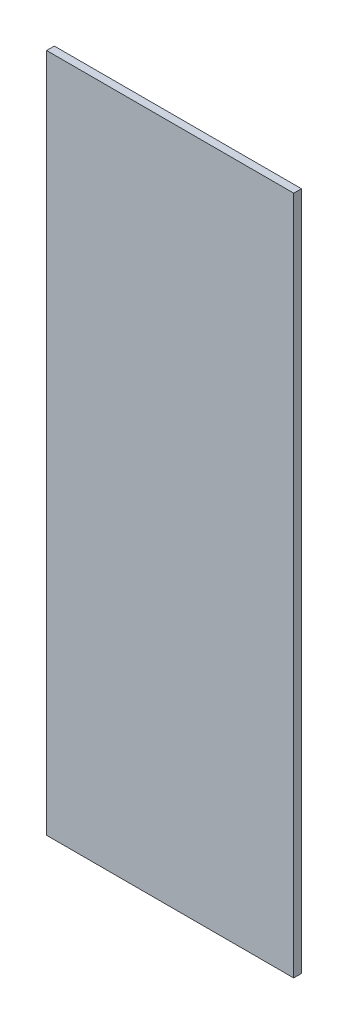
ISO-10303-21;
HEADER;
FILE_DESCRIPTION(('STEP AP214'),'2;1');
FILE_NAME('part.step','',(''),(''),'','','');
FILE_SCHEMA(('AUTOMOTIVE_DESIGN { 1 0 10303 214 1 1 1 1 }'));
ENDSEC;
DATA;
#1=APPLICATION_CONTEXT('core data for automotive mechanical design processes');
#2=APPLICATION_PROTOCOL_DEFINITION('international standard','automotive_design',2000,#1);
#3=PRODUCT_CONTEXT('',#1,'mechanical');
#4=PRODUCT('Part','Part','',(#3));
#5=PRODUCT_RELATED_PRODUCT_CATEGORY('part','',(#4));
#6=PRODUCT_DEFINITION_FORMATION('','',#4);
#7=PRODUCT_DEFINITION_CONTEXT('part definition',#1,'design');
#8=PRODUCT_DEFINITION('design','',#6,#7);
#9=PRODUCT_DEFINITION_SHAPE('','',#8);
#10=(LENGTH_UNIT() NAMED_UNIT(*) SI_UNIT(.MILLI.,.METRE.));
#11=(NAMED_UNIT(*) PLANE_ANGLE_UNIT() SI_UNIT($,.RADIAN.));
#12=(NAMED_UNIT(*) SI_UNIT($,.STERADIAN.) SOLID_ANGLE_UNIT());
#13=UNCERTAINTY_MEASURE_WITH_UNIT(LENGTH_MEASURE(1.E-05),#10,'distance_accuracy_value','');
#14=(GEOMETRIC_REPRESENTATION_CONTEXT(3) GLOBAL_UNCERTAINTY_ASSIGNED_CONTEXT((#13)) GLOBAL_UNIT_ASSIGNED_CONTEXT((#10,
#11,#12)) REPRESENTATION_CONTEXT('',''));
#15=CARTESIAN_POINT('',(0.,0.,0.));
#16=DIRECTION('',(0.,0.,1.));
#17=DIRECTION('',(1.,0.,0.));
#18=AXIS2_PLACEMENT_3D('',#15,#16,#17);
#19=CARTESIAN_POINT('',(40.,110.,2.5));
#20=DIRECTION('',(-1.,0.,0.));
#21=DIRECTION('',(0.,-1.,0.));
#22=AXIS2_PLACEMENT_3D('',#19,#20,#21);
#23=PLANE('',#22);
#24=DIRECTION('',(0.,1.,0.));
#25=VECTOR('',#24,1.);
#26=CARTESIAN_POINT('',(40.,110.,0.));
#27=LINE('',#26,#25);
#28=CARTESIAN_POINT('',(40.,-110.,0.));
#29=VERTEX_POINT('',#28);
#30=CARTESIAN_POINT('',(40.,110.,0.));
#31=VERTEX_POINT('',#30);
#32=EDGE_CURVE('E104',#29,#31,#27,.T.);
#33=ORIENTED_EDGE('',*,*,#32,.T.);
#34=DIRECTION('',(0.,0.,-1.));
#35=VECTOR('',#34,1.);
#36=CARTESIAN_POINT('',(40.,110.,2.5));
#37=LINE('',#36,#35);
#38=CARTESIAN_POINT('',(40.,110.,2.5));
#39=VERTEX_POINT('',#38);
#40=EDGE_CURVE('E11',#39,#31,#37,.T.);
#41=ORIENTED_EDGE('',*,*,#40,.F.);
#42=DIRECTION('',(0.,1.,0.));
#43=VECTOR('',#42,1.);
#44=CARTESIAN_POINT('',(40.,110.,2.5));
#45=LINE('',#44,#43);
#46=CARTESIAN_POINT('',(40.,-110.,2.5));
#47=VERTEX_POINT('',#46);
#48=EDGE_CURVE('E92',#47,#39,#45,.T.);
#49=ORIENTED_EDGE('',*,*,#48,.F.);
#50=DIRECTION('',(0.,0.,-1.));
#51=VECTOR('',#50,1.);
#52=CARTESIAN_POINT('',(40.,-110.,2.5));
#53=LINE('',#52,#51);
#54=EDGE_CURVE('E100',#47,#29,#53,.T.);
#55=ORIENTED_EDGE('',*,*,#54,.T.);
#56=EDGE_LOOP('',(#33,#41,#49,#55));
#57=FACE_BOUND('',#56,.T.);
#58=ADVANCED_FACE('F41',(#57),#23,.F.);
#59=CARTESIAN_POINT('',(-40.,110.,2.5));
#60=DIRECTION('',(0.,-1.,0.));
#61=DIRECTION('',(0.,0.,-1.));
#62=AXIS2_PLACEMENT_3D('',#59,#60,#61);
#63=PLANE('',#62);
#64=DIRECTION('',(-1.,0.,0.));
#65=VECTOR('',#64,1.);
#66=CARTESIAN_POINT('',(-40.,110.,0.));
#67=LINE('',#66,#65);
#68=CARTESIAN_POINT('',(-40.,110.,0.));
#69=VERTEX_POINT('',#68);
#70=EDGE_CURVE('E96',#31,#69,#67,.T.);
#71=ORIENTED_EDGE('',*,*,#70,.T.);
#72=DIRECTION('',(0.,0.,-1.));
#73=VECTOR('',#72,1.);
#74=CARTESIAN_POINT('',(-40.,110.,2.5));
#75=LINE('',#74,#73);
#76=CARTESIAN_POINT('',(-40.,110.,2.5));
#77=VERTEX_POINT('',#76);
#78=EDGE_CURVE('E49',#77,#69,#75,.T.);
#79=ORIENTED_EDGE('',*,*,#78,.F.);
#80=DIRECTION('',(-1.,0.,0.));
#81=VECTOR('',#80,1.);
#82=CARTESIAN_POINT('',(-40.,110.,2.5));
#83=LINE('',#82,#81);
#84=EDGE_CURVE('E87',#39,#77,#83,.T.);
#85=ORIENTED_EDGE('',*,*,#84,.F.);
#86=ORIENTED_EDGE('',*,*,#40,.T.);
#87=EDGE_LOOP('',(#71,#79,#85,#86));
#88=FACE_BOUND('',#87,.T.);
#89=ADVANCED_FACE('F95',(#88),#63,.F.);
#90=CARTESIAN_POINT('',(-40.,110.,2.5));
#91=DIRECTION('',(1.,0.,0.));
#92=DIRECTION('',(0.,1.,0.));
#93=AXIS2_PLACEMENT_3D('',#90,#91,#92);
#94=PLANE('',#93);
#95=DIRECTION('',(0.,-1.,0.));
#96=VECTOR('',#95,1.);
#97=CARTESIAN_POINT('',(-40.,110.,0.));
#98=LINE('',#97,#96);
#99=CARTESIAN_POINT('',(-40.,-110.,0.));
#100=VERTEX_POINT('',#99);
#101=EDGE_CURVE('E74',#69,#100,#98,.T.);
#102=ORIENTED_EDGE('',*,*,#101,.T.);
#103=DIRECTION('',(0.,0.,-1.));
#104=VECTOR('',#103,1.);
#105=CARTESIAN_POINT('',(-40.,-110.,2.5));
#106=LINE('',#105,#104);
#107=CARTESIAN_POINT('',(-40.,-110.,2.5));
#108=VERTEX_POINT('',#107);
#109=EDGE_CURVE('E97',#108,#100,#106,.T.);
#110=ORIENTED_EDGE('',*,*,#109,.F.);
#111=DIRECTION('',(0.,-1.,0.));
#112=VECTOR('',#111,1.);
#113=CARTESIAN_POINT('',(-40.,110.,2.5));
#114=LINE('',#113,#112);
#115=EDGE_CURVE('E90',#77,#108,#114,.T.);
#116=ORIENTED_EDGE('',*,*,#115,.F.);
#117=ORIENTED_EDGE('',*,*,#78,.T.);
#118=EDGE_LOOP('',(#102,#110,#116,#117));
#119=FACE_BOUND('',#118,.T.);
#120=ADVANCED_FACE('F98',(#119),#94,.F.);
#121=CARTESIAN_POINT('',(-40.,-110.,2.5));
#122=DIRECTION('',(0.,1.,0.));
#123=DIRECTION('',(0.,0.,1.));
#124=AXIS2_PLACEMENT_3D('',#121,#122,#123);
#125=PLANE('',#124);
#126=DIRECTION('',(1.,0.,0.));
#127=VECTOR('',#126,1.);
#128=CARTESIAN_POINT('',(-40.,-110.,0.));
#129=LINE('',#128,#127);
#130=EDGE_CURVE('E80',#100,#29,#129,.T.);
#131=ORIENTED_EDGE('',*,*,#130,.T.);
#132=ORIENTED_EDGE('',*,*,#54,.F.);
#133=DIRECTION('',(1.,0.,0.));
#134=VECTOR('',#133,1.);
#135=CARTESIAN_POINT('',(-40.,-110.,2.5));
#136=LINE('',#135,#134);
#137=EDGE_CURVE('E57',#108,#47,#136,.T.);
#138=ORIENTED_EDGE('',*,*,#137,.F.);
#139=ORIENTED_EDGE('',*,*,#109,.T.);
#140=EDGE_LOOP('',(#131,#132,#138,#139));
#141=FACE_BOUND('',#140,.T.);
#142=ADVANCED_FACE('F111',(#141),#125,.F.);
#143=CARTESIAN_POINT('',(0.,0.,2.5));
#144=DIRECTION('',(0.,0.,1.));
#145=DIRECTION('',(1.,0.,0.));
#146=AXIS2_PLACEMENT_3D('',#143,#144,#145);
#147=PLANE('',#146);
#148=ORIENTED_EDGE('',*,*,#48,.T.);
#149=ORIENTED_EDGE('',*,*,#84,.T.);
#150=ORIENTED_EDGE('',*,*,#115,.T.);
#151=ORIENTED_EDGE('',*,*,#137,.T.);
#152=EDGE_LOOP('',(#148,#149,#150,#151));
#153=FACE_BOUND('',#152,.T.);
#154=ADVANCED_FACE('F88',(#153),#147,.T.);
#155=CARTESIAN_POINT('',(0.,0.,0.));
#156=DIRECTION('',(0.,0.,1.));
#157=DIRECTION('',(1.,0.,0.));
#158=AXIS2_PLACEMENT_3D('',#155,#156,#157);
#159=PLANE('',#158);
#160=ORIENTED_EDGE('',*,*,#32,.F.);
#161=ORIENTED_EDGE('',*,*,#130,.F.);
#162=ORIENTED_EDGE('',*,*,#101,.F.);
#163=ORIENTED_EDGE('',*,*,#70,.F.);
#164=EDGE_LOOP('',(#160,#161,#162,#163));
#165=FACE_BOUND('',#164,.T.);
#166=ADVANCED_FACE('F114',(#165),#159,.F.);
#167=CLOSED_SHELL('',(#58,#89,#120,#142,#154,#166));
#168=MANIFOLD_SOLID_BREP('B2',#167);
#169=ADVANCED_BREP_SHAPE_REPRESENTATION('',(#18,#168),#14);
#170=SHAPE_DEFINITION_REPRESENTATION(#9,#169);
ENDSEC;
END-ISO-10303-21;
